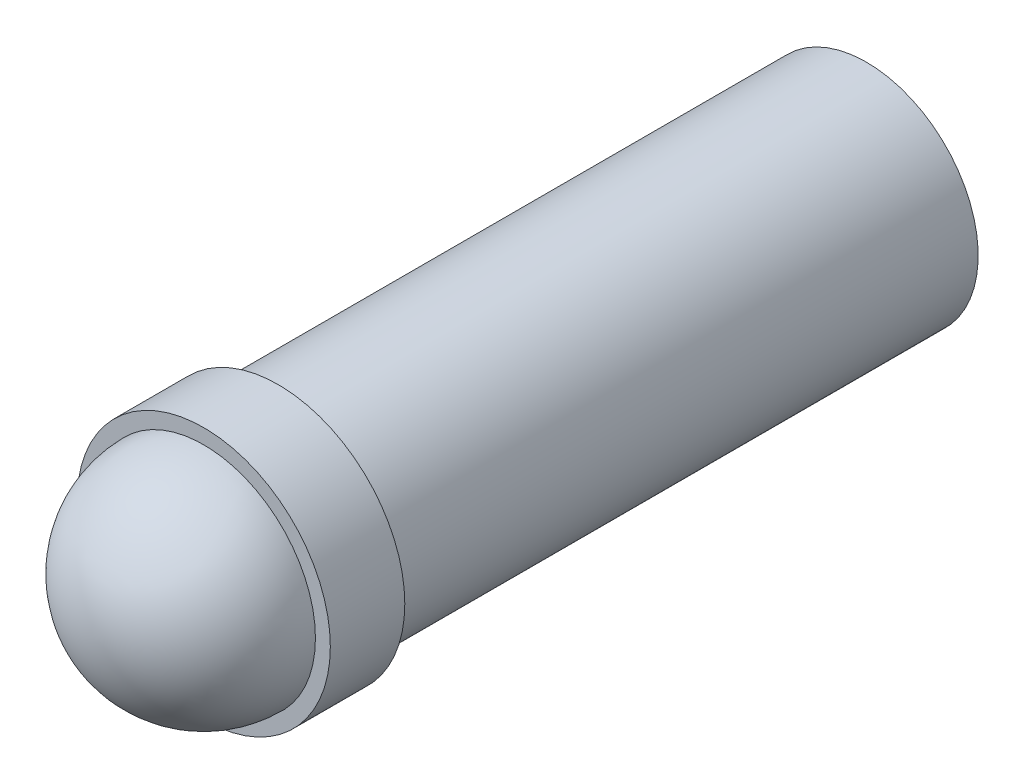
ISO-10303-21;
HEADER;
FILE_DESCRIPTION(('STEP AP214'),'2;1');
FILE_NAME('part.step','',(''),(''),'','','');
FILE_SCHEMA(('AUTOMOTIVE_DESIGN { 1 0 10303 214 1 1 1 1 }'));
ENDSEC;
DATA;
#1=APPLICATION_CONTEXT('core data for automotive mechanical design processes');
#2=APPLICATION_PROTOCOL_DEFINITION('international standard','automotive_design',2000,#1);
#3=PRODUCT_CONTEXT('',#1,'mechanical');
#4=PRODUCT('Part','Part','',(#3));
#5=PRODUCT_RELATED_PRODUCT_CATEGORY('part','',(#4));
#6=PRODUCT_DEFINITION_FORMATION('','',#4);
#7=PRODUCT_DEFINITION_CONTEXT('part definition',#1,'design');
#8=PRODUCT_DEFINITION('design','',#6,#7);
#9=PRODUCT_DEFINITION_SHAPE('','',#8);
#10=(LENGTH_UNIT() NAMED_UNIT(*) SI_UNIT(.MILLI.,.METRE.));
#11=(NAMED_UNIT(*) PLANE_ANGLE_UNIT() SI_UNIT($,.RADIAN.));
#12=(NAMED_UNIT(*) SI_UNIT($,.STERADIAN.) SOLID_ANGLE_UNIT());
#13=UNCERTAINTY_MEASURE_WITH_UNIT(LENGTH_MEASURE(1.E-05),#10,'distance_accuracy_value','');
#14=(GEOMETRIC_REPRESENTATION_CONTEXT(3) GLOBAL_UNCERTAINTY_ASSIGNED_CONTEXT((#13)) GLOBAL_UNIT_ASSIGNED_CONTEXT((#10,
#11,#12)) REPRESENTATION_CONTEXT('',''));
#15=CARTESIAN_POINT('',(0.,0.,0.));
#16=DIRECTION('',(0.,0.,1.));
#17=DIRECTION('',(1.,0.,0.));
#18=AXIS2_PLACEMENT_3D('',#15,#16,#17);
#19=CARTESIAN_POINT('',(0.,0.,104.));
#20=DIRECTION('',(0.,0.,-1.));
#21=DIRECTION('',(-1.,0.,0.));
#22=AXIS2_PLACEMENT_3D('',#19,#20,#21);
#23=CYLINDRICAL_SURFACE('',#22,15.);
#24=CARTESIAN_POINT('',(0.,0.,0.));
#25=DIRECTION('',(0.,0.,1.));
#26=DIRECTION('',(1.,0.,0.));
#27=AXIS2_PLACEMENT_3D('',#24,#25,#26);
#28=CIRCLE('',#27,15.);
#29=CARTESIAN_POINT('',(-15.,0.,0.));
#30=VERTEX_POINT('',#29);
#31=EDGE_CURVE('E48',#30,#30,#28,.T.);
#32=CARTESIAN_POINT('',(0.,0.,79.));
#33=DIRECTION('',(0.,0.,1.));
#34=DIRECTION('',(1.,0.,0.));
#35=AXIS2_PLACEMENT_3D('',#32,#33,#34);
#36=CIRCLE('',#35,15.);
#37=CARTESIAN_POINT('',(-15.,0.,79.));
#38=VERTEX_POINT('',#37);
#39=EDGE_CURVE('E10',#38,#38,#36,.T.);
#40=CARTESIAN_POINT('',(-15.,0.,0.));
#41=CARTESIAN_POINT('',(-15.,0.,0.822916666666669));
#42=CARTESIAN_POINT('',(-15.,0.,1.64583333333334));
#43=CARTESIAN_POINT('',(-15.,0.,3.29166666666667));
#44=CARTESIAN_POINT('',(-15.,0.,4.11458333333333));
#45=CARTESIAN_POINT('',(-15.,0.,5.76041666666667));
#46=CARTESIAN_POINT('',(-15.,0.,6.58333333333333));
#47=CARTESIAN_POINT('',(-15.,0.,8.22916666666667));
#48=CARTESIAN_POINT('',(-15.,0.,9.05208333333333));
#49=CARTESIAN_POINT('',(-15.,0.,10.6979166666667));
#50=CARTESIAN_POINT('',(-15.,0.,11.5208333333333));
#51=CARTESIAN_POINT('',(-15.,0.,13.1666666666667));
#52=CARTESIAN_POINT('',(-15.,0.,13.9895833333333));
#53=CARTESIAN_POINT('',(-15.,0.,15.6354166666667));
#54=CARTESIAN_POINT('',(-15.,0.,16.4583333333333));
#55=CARTESIAN_POINT('',(-15.,0.,18.1041666666667));
#56=CARTESIAN_POINT('',(-15.,0.,18.9270833333333));
#57=CARTESIAN_POINT('',(-15.,0.,20.5729166666667));
#58=CARTESIAN_POINT('',(-15.,0.,21.3958333333333));
#59=CARTESIAN_POINT('',(-15.,0.,23.0416666666667));
#60=CARTESIAN_POINT('',(-15.,0.,23.8645833333333));
#61=CARTESIAN_POINT('',(-15.,0.,25.5104166666667));
#62=CARTESIAN_POINT('',(-15.,0.,26.3333333333333));
#63=CARTESIAN_POINT('',(-15.,0.,27.9791666666667));
#64=CARTESIAN_POINT('',(-15.,0.,28.8020833333333));
#65=CARTESIAN_POINT('',(-15.,0.,30.4479166666667));
#66=CARTESIAN_POINT('',(-15.,0.,31.2708333333333));
#67=CARTESIAN_POINT('',(-15.,0.,32.9166666666667));
#68=CARTESIAN_POINT('',(-15.,0.,33.7395833333333));
#69=CARTESIAN_POINT('',(-15.,0.,35.3854166666667));
#70=CARTESIAN_POINT('',(-15.,0.,36.2083333333333));
#71=CARTESIAN_POINT('',(-15.,0.,37.8541666666667));
#72=CARTESIAN_POINT('',(-15.,0.,38.6770833333333));
#73=CARTESIAN_POINT('',(-15.,0.,40.3229166666667));
#74=CARTESIAN_POINT('',(-15.,0.,41.1458333333333));
#75=CARTESIAN_POINT('',(-15.,0.,42.7916666666667));
#76=CARTESIAN_POINT('',(-15.,0.,43.6145833333333));
#77=CARTESIAN_POINT('',(-15.,0.,45.2604166666667));
#78=CARTESIAN_POINT('',(-15.,0.,46.0833333333333));
#79=CARTESIAN_POINT('',(-15.,0.,47.7291666666667));
#80=CARTESIAN_POINT('',(-15.,0.,48.5520833333333));
#81=CARTESIAN_POINT('',(-15.,0.,50.1979166666667));
#82=CARTESIAN_POINT('',(-15.,0.,51.0208333333333));
#83=CARTESIAN_POINT('',(-15.,0.,52.6666666666667));
#84=CARTESIAN_POINT('',(-15.,0.,53.4895833333333));
#85=CARTESIAN_POINT('',(-15.,0.,55.1354166666667));
#86=CARTESIAN_POINT('',(-15.,0.,55.9583333333333));
#87=CARTESIAN_POINT('',(-15.,0.,57.6041666666667));
#88=CARTESIAN_POINT('',(-15.,0.,58.4270833333333));
#89=CARTESIAN_POINT('',(-15.,0.,60.0729166666667));
#90=CARTESIAN_POINT('',(-15.,0.,60.8958333333333));
#91=CARTESIAN_POINT('',(-15.,0.,62.5416666666667));
#92=CARTESIAN_POINT('',(-15.,0.,63.3645833333333));
#93=CARTESIAN_POINT('',(-15.,0.,65.0104166666667));
#94=CARTESIAN_POINT('',(-15.,0.,65.8333333333333));
#95=CARTESIAN_POINT('',(-15.,0.,67.4791666666667));
#96=CARTESIAN_POINT('',(-15.,0.,68.3020833333333));
#97=CARTESIAN_POINT('',(-15.,0.,69.9479166666667));
#98=CARTESIAN_POINT('',(-15.,0.,70.7708333333334));
#99=CARTESIAN_POINT('',(-15.,0.,72.4166666666667));
#100=CARTESIAN_POINT('',(-15.,0.,73.2395833333333));
#101=CARTESIAN_POINT('',(-15.,0.,74.8854166666667));
#102=CARTESIAN_POINT('',(-15.,0.,75.7083333333333));
#103=CARTESIAN_POINT('',(-15.,0.,77.3541666666667));
#104=CARTESIAN_POINT('',(-15.,0.,78.1770833333333));
#105=CARTESIAN_POINT('',(-15.,0.,79.));
#106=B_SPLINE_CURVE_WITH_KNOTS('',3,(#40,#41,#42,#43,#44,#45,#46,#47,#48,#49,#50,#51,#52,#53,
#54,#55,#56,#57,#58,#59,#60,#61,#62,#63,#64,#65,#66,#67,#68,#69,#70,#71,#72,#73,#74,#75,#76,#77,
#78,#79,#80,#81,#82,#83,#84,#85,#86,#87,#88,#89,#90,#91,#92,#93,#94,#95,#96,#97,#98,#99,#100,
#101,#102,#103,#104,#105),.UNSPECIFIED.,.F.,.F.,(4,2,2,2,2,2,2,2,2,2,2,2,2,2,2,2,2,2,2,2,2,2,2,
2,2,2,2,2,2,2,2,2,4),(0.,2.46875000000001,4.9375,7.40625,9.87499999999999,12.34375,14.8125,
17.28125,19.75,22.21875,24.6875,27.15625,29.625,32.09375,34.5625,37.03125,39.5,41.96875,44.4375,
46.90625,49.375,51.84375,54.3125,56.78125,59.25,61.71875,64.1875,66.65625,69.125,71.59375,
74.0625,76.53125,79.),.UNSPECIFIED.);
#107=EDGE_CURVE('BSEAM40',#30,#38,#106,.T.);
#108=ORIENTED_EDGE('',*,*,#31,.T.);
#109=ORIENTED_EDGE('',*,*,#39,.F.);
#110=ORIENTED_EDGE('',*,*,#107,.T.);
#111=ORIENTED_EDGE('',*,*,#107,.F.);
#112=EDGE_LOOP('',(#108,#110,#109,#111));
#113=FACE_BOUND('',#112,.T.);
#114=ADVANCED_FACE('F40',(#113),#23,.T.);
#115=CARTESIAN_POINT('',(0.,0.,0.));
#116=DIRECTION('',(0.,0.,1.));
#117=DIRECTION('',(1.,0.,0.));
#118=AXIS2_PLACEMENT_3D('',#115,#116,#117);
#119=PLANE('',#118);
#120=ORIENTED_EDGE('',*,*,#31,.F.);
#121=EDGE_LOOP('',(#120));
#122=FACE_BOUND('',#121,.T.);
#123=ADVANCED_FACE('F73',(#122),#119,.F.);
#124=CARTESIAN_POINT('',(0.,0.,89.));
#125=DIRECTION('',(0.,0.,1.));
#126=DIRECTION('',(1.,0.,0.));
#127=AXIS2_PLACEMENT_3D('',#124,#125,#126);
#128=PLANE('',#127);
#129=CARTESIAN_POINT('',(0.,0.,89.));
#130=DIRECTION('',(0.,0.,1.));
#131=DIRECTION('',(1.,0.,0.));
#132=AXIS2_PLACEMENT_3D('',#129,#130,#131);
#133=CIRCLE('',#132,17.);
#134=CARTESIAN_POINT('',(17.,0.,89.));
#135=VERTEX_POINT('',#134);
#136=EDGE_CURVE('E55',#135,#135,#133,.T.);
#137=ORIENTED_EDGE('',*,*,#136,.T.);
#138=EDGE_LOOP('',(#137));
#139=FACE_BOUND('',#138,.T.);
#140=CARTESIAN_POINT('',(0.,0.,89.));
#141=DIRECTION('',(0.,0.,-1.));
#142=DIRECTION('',(-1.,0.,0.));
#143=AXIS2_PLACEMENT_3D('',#140,#141,#142);
#144=CIRCLE('',#143,15.);
#145=CARTESIAN_POINT('',(-15.,0.,89.));
#146=VERTEX_POINT('',#145);
#147=EDGE_CURVE('E42',#146,#146,#144,.T.);
#148=ORIENTED_EDGE('',*,*,#147,.T.);
#149=EDGE_LOOP('',(#148));
#150=FACE_BOUND('',#149,.T.);
#151=ADVANCED_FACE('F63',(#139,#150),#128,.T.);
#152=CARTESIAN_POINT('',(0.,0.,79.));
#153=DIRECTION('',(0.,0.,1.));
#154=DIRECTION('',(1.,0.,0.));
#155=AXIS2_PLACEMENT_3D('',#152,#153,#154);
#156=PLANE('',#155);
#157=CARTESIAN_POINT('',(0.,0.,79.));
#158=DIRECTION('',(0.,0.,1.));
#159=DIRECTION('',(1.,0.,0.));
#160=AXIS2_PLACEMENT_3D('',#157,#158,#159);
#161=CIRCLE('',#160,17.);
#162=CARTESIAN_POINT('',(17.,0.,79.));
#163=VERTEX_POINT('',#162);
#164=EDGE_CURVE('E54',#163,#163,#161,.T.);
#165=ORIENTED_EDGE('',*,*,#164,.F.);
#166=EDGE_LOOP('',(#165));
#167=FACE_BOUND('',#166,.T.);
#168=ORIENTED_EDGE('',*,*,#39,.T.);
#169=EDGE_LOOP('',(#168));
#170=FACE_BOUND('',#169,.T.);
#171=ADVANCED_FACE('F67',(#167,#170),#156,.F.);
#172=CARTESIAN_POINT('',(0.,0.,89.));
#173=DIRECTION('',(0.,0.,-1.));
#174=DIRECTION('',(-1.,0.,0.));
#175=AXIS2_PLACEMENT_3D('',#172,#173,#174);
#176=CYLINDRICAL_SURFACE('',#175,17.);
#177=ORIENTED_EDGE('',*,*,#136,.F.);
#178=EDGE_LOOP('',(#177));
#179=FACE_BOUND('',#178,.T.);
#180=ORIENTED_EDGE('',*,*,#164,.T.);
#181=EDGE_LOOP('',(#180));
#182=FACE_BOUND('',#181,.T.);
#183=ADVANCED_FACE('F62',(#179,#182),#176,.T.);
#184=CARTESIAN_POINT('',(0.,0.,89.));
#185=DIRECTION('',(0.,0.,1.));
#186=DIRECTION('',(1.,0.,0.));
#187=AXIS2_PLACEMENT_3D('',#184,#185,#186);
#188=SPHERICAL_SURFACE('',#187,15.);
#189=ORIENTED_EDGE('',*,*,#147,.F.);
#190=EDGE_LOOP('',(#189));
#191=FACE_BOUND('',#190,.T.);
#192=ADVANCED_FACE('F39',(#191),#188,.T.);
#193=CLOSED_SHELL('',(#114,#123,#151,#171,#183,#192));
#194=MANIFOLD_SOLID_BREP('B2',#193);
#195=ADVANCED_BREP_SHAPE_REPRESENTATION('',(#18,#194),#14);
#196=SHAPE_DEFINITION_REPRESENTATION(#9,#195);
ENDSEC;
END-ISO-10303-21;
